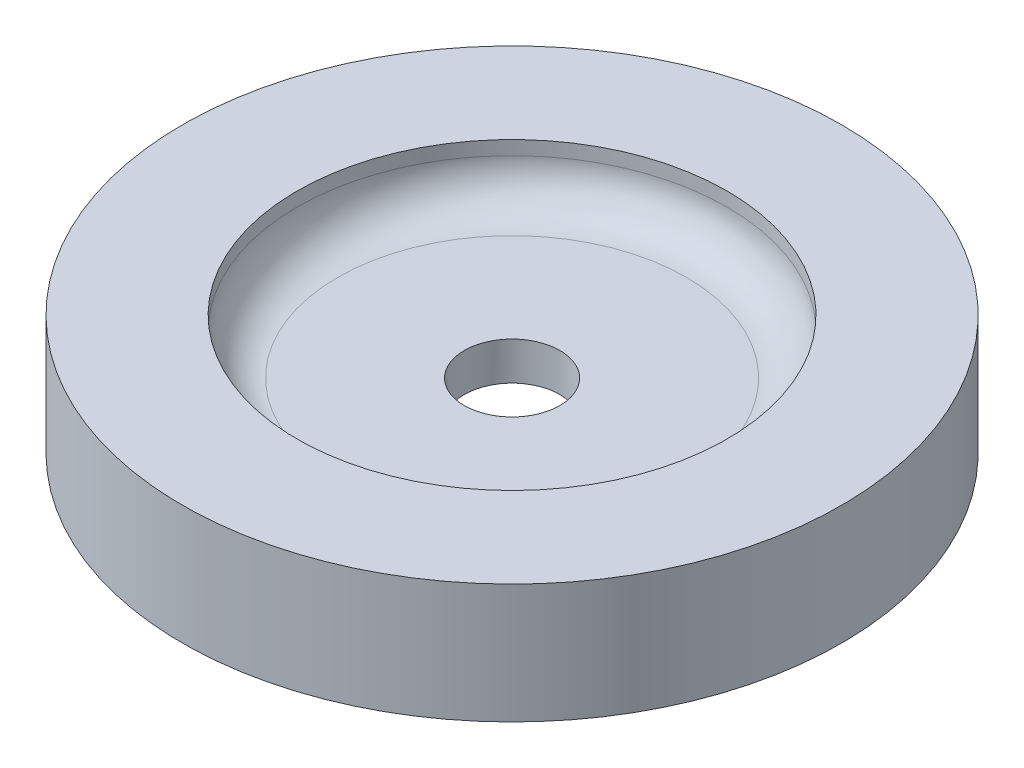
ISO-10303-21;
HEADER;
FILE_DESCRIPTION(('STEP AP214'),'2;1');
FILE_NAME('part.step','',(''),(''),'','','');
FILE_SCHEMA(('AUTOMOTIVE_DESIGN { 1 0 10303 214 1 1 1 1 }'));
ENDSEC;
DATA;
#1=APPLICATION_CONTEXT('core data for automotive mechanical design processes');
#2=APPLICATION_PROTOCOL_DEFINITION('international standard','automotive_design',2000,#1);
#3=PRODUCT_CONTEXT('',#1,'mechanical');
#4=PRODUCT('Part','Part','',(#3));
#5=PRODUCT_RELATED_PRODUCT_CATEGORY('part','',(#4));
#6=PRODUCT_DEFINITION_FORMATION('','',#4);
#7=PRODUCT_DEFINITION_CONTEXT('part definition',#1,'design');
#8=PRODUCT_DEFINITION('design','',#6,#7);
#9=PRODUCT_DEFINITION_SHAPE('','',#8);
#10=(LENGTH_UNIT() NAMED_UNIT(*) SI_UNIT(.MILLI.,.METRE.));
#11=(NAMED_UNIT(*) PLANE_ANGLE_UNIT() SI_UNIT($,.RADIAN.));
#12=(NAMED_UNIT(*) SI_UNIT($,.STERADIAN.) SOLID_ANGLE_UNIT());
#13=UNCERTAINTY_MEASURE_WITH_UNIT(LENGTH_MEASURE(1.E-05),#10,'distance_accuracy_value','');
#14=(GEOMETRIC_REPRESENTATION_CONTEXT(3) GLOBAL_UNCERTAINTY_ASSIGNED_CONTEXT((#13)) GLOBAL_UNIT_ASSIGNED_CONTEXT((#10,
#11,#12)) REPRESENTATION_CONTEXT('',''));
#15=CARTESIAN_POINT('',(0.,0.,0.));
#16=DIRECTION('',(0.,0.,1.));
#17=DIRECTION('',(1.,0.,0.));
#18=AXIS2_PLACEMENT_3D('',#15,#16,#17);
#19=CARTESIAN_POINT('',(0.,7.08659999999999,0.));
#20=DIRECTION('',(0.,-1.,0.));
#21=DIRECTION('',(0.,0.,-1.));
#22=AXIS2_PLACEMENT_3D('',#19,#20,#21);
#23=CYLINDRICAL_SURFACE('',#22,87.63);
#24=CARTESIAN_POINT('',(0.,31.75,0.));
#25=DIRECTION('',(0.,-1.,0.));
#26=DIRECTION('',(0.,0.,-1.));
#27=AXIS2_PLACEMENT_3D('',#24,#25,#26);
#28=CIRCLE('',#27,87.63);
#29=CARTESIAN_POINT('',(0.,31.75,-87.63));
#30=VERTEX_POINT('',#29);
#31=EDGE_CURVE('E75',#30,#30,#28,.T.);
#32=ORIENTED_EDGE('',*,*,#31,.T.);
#33=EDGE_LOOP('',(#32));
#34=FACE_BOUND('',#33,.T.);
#35=CARTESIAN_POINT('',(0.,0.,0.));
#36=DIRECTION('',(0.,-1.,0.));
#37=DIRECTION('',(0.,0.,-1.));
#38=AXIS2_PLACEMENT_3D('',#35,#36,#37);
#39=CIRCLE('',#38,87.63);
#40=CARTESIAN_POINT('',(0.,0.,-87.63));
#41=VERTEX_POINT('',#40);
#42=EDGE_CURVE('E61',#41,#41,#39,.T.);
#43=ORIENTED_EDGE('',*,*,#42,.F.);
#44=EDGE_LOOP('',(#43));
#45=FACE_BOUND('',#44,.T.);
#46=ADVANCED_FACE('F43',(#34,#45),#23,.T.);
#47=CARTESIAN_POINT('',(87.63,0.,0.));
#48=DIRECTION('',(0.,-1.,0.));
#49=DIRECTION('',(0.,0.,-1.));
#50=AXIS2_PLACEMENT_3D('',#47,#48,#49);
#51=PLANE('',#50);
#52=ORIENTED_EDGE('',*,*,#42,.T.);
#53=EDGE_LOOP('',(#52));
#54=FACE_BOUND('',#53,.T.);
#55=CARTESIAN_POINT('',(0.,0.,0.));
#56=DIRECTION('',(0.,-1.,0.));
#57=DIRECTION('',(0.,0.,-1.));
#58=AXIS2_PLACEMENT_3D('',#55,#56,#57);
#59=CIRCLE('',#58,57.15);
#60=CARTESIAN_POINT('',(0.,0.,-57.15));
#61=VERTEX_POINT('',#60);
#62=EDGE_CURVE('E67',#61,#61,#59,.T.);
#63=ORIENTED_EDGE('',*,*,#62,.F.);
#64=EDGE_LOOP('',(#63));
#65=FACE_BOUND('',#64,.T.);
#66=ADVANCED_FACE('F102',(#54,#65),#51,.T.);
#67=CARTESIAN_POINT('',(57.15,7.08659999999999,0.));
#68=DIRECTION('',(0.,-1.,0.));
#69=DIRECTION('',(0.,0.,-1.));
#70=AXIS2_PLACEMENT_3D('',#67,#68,#69);
#71=PLANE('',#70);
#72=CARTESIAN_POINT('',(0.,7.08659999999999,0.));
#73=DIRECTION('',(0.,-1.,0.));
#74=DIRECTION('',(0.,0.,-1.));
#75=AXIS2_PLACEMENT_3D('',#72,#73,#74);
#76=CIRCLE('',#75,12.7);
#77=CARTESIAN_POINT('',(0.,7.08659999999999,-12.7));
#78=VERTEX_POINT('',#77);
#79=EDGE_CURVE('E79',#78,#78,#76,.T.);
#80=ORIENTED_EDGE('',*,*,#79,.F.);
#81=EDGE_LOOP('',(#80));
#82=FACE_BOUND('',#81,.T.);
#83=CARTESIAN_POINT('',(0.,7.08659999999999,0.));
#84=DIRECTION('',(0.,-1.,0.));
#85=DIRECTION('',(0.,0.,-1.));
#86=AXIS2_PLACEMENT_3D('',#83,#84,#85);
#87=CIRCLE('',#86,47.0119629888227);
#88=CARTESIAN_POINT('',(0.,7.08659999999999,-47.0119629888227));
#89=VERTEX_POINT('',#88);
#90=EDGE_CURVE('E56',#89,#89,#87,.T.);
#91=ORIENTED_EDGE('',*,*,#90,.T.);
#92=EDGE_LOOP('',(#91));
#93=FACE_BOUND('',#92,.T.);
#94=ADVANCED_FACE('F93',(#82,#93),#71,.T.);
#95=CARTESIAN_POINT('',(0.,17.2466,0.));
#96=DIRECTION('',(0.,1.,0.));
#97=DIRECTION('',(0.,0.,1.));
#98=AXIS2_PLACEMENT_3D('',#95,#96,#97);
#99=PLANE('',#98);
#100=CARTESIAN_POINT('',(0.,17.2466,0.));
#101=DIRECTION('',(0.,1.,0.));
#102=DIRECTION('',(0.,0.,1.));
#103=AXIS2_PLACEMENT_3D('',#100,#101,#102);
#104=CIRCLE('',#103,12.7);
#105=CARTESIAN_POINT('',(0.,17.2466,12.7));
#106=VERTEX_POINT('',#105);
#107=EDGE_CURVE('E83',#106,#106,#104,.T.);
#108=ORIENTED_EDGE('',*,*,#107,.F.);
#109=EDGE_LOOP('',(#108));
#110=FACE_BOUND('',#109,.T.);
#111=CARTESIAN_POINT('',(0.,17.2466,0.));
#112=DIRECTION('',(0.,1.,0.));
#113=DIRECTION('',(0.,0.,1.));
#114=AXIS2_PLACEMENT_3D('',#111,#112,#113);
#115=CIRCLE('',#114,46.355);
#116=CARTESIAN_POINT('',(0.,17.2466,46.355));
#117=VERTEX_POINT('',#116);
#118=EDGE_CURVE('E10',#117,#117,#115,.T.);
#119=ORIENTED_EDGE('',*,*,#118,.T.);
#120=EDGE_LOOP('',(#119));
#121=FACE_BOUND('',#120,.T.);
#122=ADVANCED_FACE('F90',(#110,#121),#99,.T.);
#123=CARTESIAN_POINT('',(0.,7.08659999999999,0.));
#124=DIRECTION('',(0.,-1.,0.));
#125=DIRECTION('',(0.,0.,-1.));
#126=AXIS2_PLACEMENT_3D('',#123,#124,#125);
#127=CYLINDRICAL_SURFACE('',#126,57.15);
#128=CARTESIAN_POINT('',(0.,28.0416,0.));
#129=DIRECTION('',(0.,1.,0.));
#130=DIRECTION('',(0.,0.,1.));
#131=AXIS2_PLACEMENT_3D('',#128,#129,#130);
#132=CIRCLE('',#131,57.15);
#133=CARTESIAN_POINT('',(0.,28.0416,57.15));
#134=VERTEX_POINT('',#133);
#135=EDGE_CURVE('E51',#134,#134,#132,.F.);
#136=ORIENTED_EDGE('',*,*,#135,.T.);
#137=EDGE_LOOP('',(#136));
#138=FACE_BOUND('',#137,.T.);
#139=CARTESIAN_POINT('',(0.,31.75,0.));
#140=DIRECTION('',(0.,-1.,0.));
#141=DIRECTION('',(0.,0.,-1.));
#142=AXIS2_PLACEMENT_3D('',#139,#140,#141);
#143=CIRCLE('',#142,57.15);
#144=CARTESIAN_POINT('',(0.,31.75,-57.15));
#145=VERTEX_POINT('',#144);
#146=EDGE_CURVE('E71',#145,#145,#143,.T.);
#147=ORIENTED_EDGE('',*,*,#146,.F.);
#148=EDGE_LOOP('',(#147));
#149=FACE_BOUND('',#148,.T.);
#150=ADVANCED_FACE('F92',(#138,#149),#127,.F.);
#151=CARTESIAN_POINT('',(57.15,31.75,0.));
#152=DIRECTION('',(0.,1.,0.));
#153=DIRECTION('',(0.,0.,1.));
#154=AXIS2_PLACEMENT_3D('',#151,#152,#153);
#155=PLANE('',#154);
#156=ORIENTED_EDGE('',*,*,#146,.T.);
#157=EDGE_LOOP('',(#156));
#158=FACE_BOUND('',#157,.T.);
#159=ORIENTED_EDGE('',*,*,#31,.F.);
#160=EDGE_LOOP('',(#159));
#161=FACE_BOUND('',#160,.T.);
#162=ADVANCED_FACE('F100',(#158,#161),#155,.T.);
#163=CARTESIAN_POINT('',(0.,-3.70840000000001,0.));
#164=DIRECTION('',(0.,1.,0.));
#165=DIRECTION('',(0.,0.,1.));
#166=AXIS2_PLACEMENT_3D('',#163,#164,#165);
#167=TOROIDAL_SURFACE('',#166,47.0119629888227,10.795);
#168=ORIENTED_EDGE('',*,*,#62,.T.);
#169=EDGE_LOOP('',(#168));
#170=FACE_BOUND('',#169,.T.);
#171=ORIENTED_EDGE('',*,*,#90,.F.);
#172=EDGE_LOOP('',(#171));
#173=FACE_BOUND('',#172,.T.);
#174=ADVANCED_FACE('F114',(#170,#173),#167,.F.);
#175=CARTESIAN_POINT('',(0.,28.0416,0.));
#176=DIRECTION('',(0.,1.,0.));
#177=DIRECTION('',(0.,0.,1.));
#178=AXIS2_PLACEMENT_3D('',#175,#176,#177);
#179=TOROIDAL_SURFACE('',#178,46.355,10.795);
#180=ORIENTED_EDGE('',*,*,#118,.F.);
#181=EDGE_LOOP('',(#180));
#182=FACE_BOUND('',#181,.T.);
#183=ORIENTED_EDGE('',*,*,#135,.F.);
#184=EDGE_LOOP('',(#183));
#185=FACE_BOUND('',#184,.T.);
#186=ADVANCED_FACE('F45',(#182,#185),#179,.F.);
#187=CARTESIAN_POINT('',(0.,17.2466,0.));
#188=DIRECTION('',(0.,1.,0.));
#189=DIRECTION('',(0.,0.,1.));
#190=AXIS2_PLACEMENT_3D('',#187,#188,#189);
#191=CYLINDRICAL_SURFACE('',#190,12.7);
#192=ORIENTED_EDGE('',*,*,#79,.T.);
#193=EDGE_LOOP('',(#192));
#194=FACE_BOUND('',#193,.T.);
#195=ORIENTED_EDGE('',*,*,#107,.T.);
#196=EDGE_LOOP('',(#195));
#197=FACE_BOUND('',#196,.T.);
#198=ADVANCED_FACE('F88',(#194,#197),#191,.F.);
#199=CLOSED_SHELL('',(#46,#66,#94,#122,#150,#162,#174,#186,#198));
#200=MANIFOLD_SOLID_BREP('B2',#199);
#201=ADVANCED_BREP_SHAPE_REPRESENTATION('',(#18,#200),#14);
#202=SHAPE_DEFINITION_REPRESENTATION(#9,#201);
ENDSEC;
END-ISO-10303-21;
